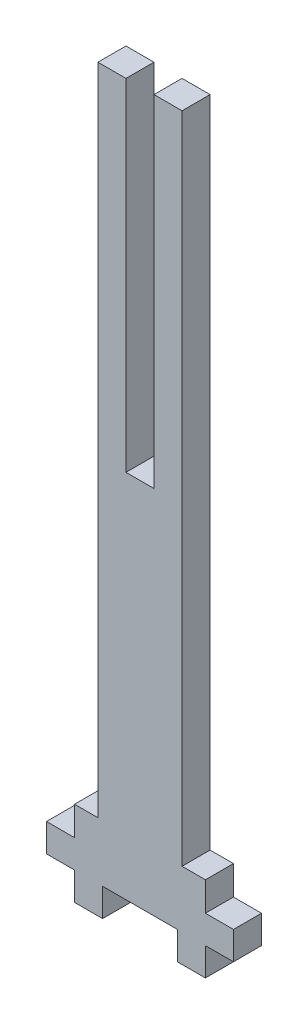
ISO-10303-21;
HEADER;
FILE_DESCRIPTION(('STEP AP214'),'2;1');
FILE_NAME('part.step','',(''),(''),'','','');
FILE_SCHEMA(('AUTOMOTIVE_DESIGN { 1 0 10303 214 1 1 1 1 }'));
ENDSEC;
DATA;
#1=APPLICATION_CONTEXT('core data for automotive mechanical design processes');
#2=APPLICATION_PROTOCOL_DEFINITION('international standard','automotive_design',2000,#1);
#3=PRODUCT_CONTEXT('',#1,'mechanical');
#4=PRODUCT('Part','Part','',(#3));
#5=PRODUCT_RELATED_PRODUCT_CATEGORY('part','',(#4));
#6=PRODUCT_DEFINITION_FORMATION('','',#4);
#7=PRODUCT_DEFINITION_CONTEXT('part definition',#1,'design');
#8=PRODUCT_DEFINITION('design','',#6,#7);
#9=PRODUCT_DEFINITION_SHAPE('','',#8);
#10=(LENGTH_UNIT() NAMED_UNIT(*) SI_UNIT(.MILLI.,.METRE.));
#11=(NAMED_UNIT(*) PLANE_ANGLE_UNIT() SI_UNIT($,.RADIAN.));
#12=(NAMED_UNIT(*) SI_UNIT($,.STERADIAN.) SOLID_ANGLE_UNIT());
#13=UNCERTAINTY_MEASURE_WITH_UNIT(LENGTH_MEASURE(1.E-05),#10,'distance_accuracy_value','');
#14=(GEOMETRIC_REPRESENTATION_CONTEXT(3) GLOBAL_UNCERTAINTY_ASSIGNED_CONTEXT((#13)) GLOBAL_UNIT_ASSIGNED_CONTEXT((#10,
#11,#12)) REPRESENTATION_CONTEXT('',''));
#15=CARTESIAN_POINT('',(0.,0.,0.));
#16=DIRECTION('',(0.,0.,1.));
#17=DIRECTION('',(1.,0.,0.));
#18=AXIS2_PLACEMENT_3D('',#15,#16,#17);
#19=CARTESIAN_POINT('',(7.,0.,3.));
#20=DIRECTION('',(-1.,0.,0.));
#21=DIRECTION('',(0.,0.,1.));
#22=AXIS2_PLACEMENT_3D('',#19,#20,#21);
#23=PLANE('',#22);
#24=DIRECTION('',(0.,0.,1.));
#25=VECTOR('',#24,1.);
#26=CARTESIAN_POINT('',(7.,-33.545999937,0.));
#27=LINE('',#26,#25);
#28=CARTESIAN_POINT('',(7.,-33.545999937,0.));
#29=VERTEX_POINT('',#28);
#30=CARTESIAN_POINT('',(7.,-33.545999937,3.));
#31=VERTEX_POINT('',#30);
#32=EDGE_CURVE('E366',#29,#31,#27,.T.);
#33=ORIENTED_EDGE('',*,*,#32,.F.);
#34=DIRECTION('',(0.,1.,0.));
#35=VECTOR('',#34,1.);
#36=CARTESIAN_POINT('',(7.,0.,0.));
#37=LINE('',#36,#35);
#38=CARTESIAN_POINT('',(7.,-30.445999937,0.));
#39=VERTEX_POINT('',#38);
#40=EDGE_CURVE('E252',#29,#39,#37,.T.);
#41=ORIENTED_EDGE('',*,*,#40,.T.);
#42=DIRECTION('',(0.,0.,-1.));
#43=VECTOR('',#42,1.);
#44=CARTESIAN_POINT('',(7.,-30.445999937,3.));
#45=LINE('',#44,#43);
#46=CARTESIAN_POINT('',(7.,-30.445999937,3.));
#47=VERTEX_POINT('',#46);
#48=EDGE_CURVE('E274',#47,#39,#45,.T.);
#49=ORIENTED_EDGE('',*,*,#48,.F.);
#50=DIRECTION('',(0.,1.,0.));
#51=VECTOR('',#50,1.);
#52=CARTESIAN_POINT('',(7.,0.,3.));
#53=LINE('',#52,#51);
#54=EDGE_CURVE('E402',#31,#47,#53,.T.);
#55=ORIENTED_EDGE('',*,*,#54,.F.);
#56=EDGE_LOOP('',(#33,#41,#49,#55));
#57=FACE_BOUND('',#56,.T.);
#58=ADVANCED_FACE('F50',(#57),#23,.F.);
#59=CARTESIAN_POINT('',(-7.,0.,3.));
#60=DIRECTION('',(1.,0.,0.));
#61=DIRECTION('',(0.,0.,-1.));
#62=AXIS2_PLACEMENT_3D('',#59,#60,#61);
#63=PLANE('',#62);
#64=DIRECTION('',(0.,0.,1.));
#65=VECTOR('',#64,1.);
#66=CARTESIAN_POINT('',(-7.,-36.545999937,0.));
#67=LINE('',#66,#65);
#68=CARTESIAN_POINT('',(-7.,-36.545999937,0.));
#69=VERTEX_POINT('',#68);
#70=CARTESIAN_POINT('',(-7.,-36.545999937,3.));
#71=VERTEX_POINT('',#70);
#72=EDGE_CURVE('E334',#69,#71,#67,.T.);
#73=ORIENTED_EDGE('',*,*,#72,.F.);
#74=DIRECTION('',(0.,-1.,0.));
#75=VECTOR('',#74,1.);
#76=CARTESIAN_POINT('',(-7.,0.,0.));
#77=LINE('',#76,#75);
#78=CARTESIAN_POINT('',(-7.,-39.545999937,0.));
#79=VERTEX_POINT('',#78);
#80=EDGE_CURVE('E313',#69,#79,#77,.T.);
#81=ORIENTED_EDGE('',*,*,#80,.T.);
#82=DIRECTION('',(0.,0.,-1.));
#83=VECTOR('',#82,1.);
#84=CARTESIAN_POINT('',(-7.,-39.545999937,3.));
#85=LINE('',#84,#83);
#86=CARTESIAN_POINT('',(-7.,-39.545999937,3.));
#87=VERTEX_POINT('',#86);
#88=EDGE_CURVE('E287',#87,#79,#85,.T.);
#89=ORIENTED_EDGE('',*,*,#88,.F.);
#90=DIRECTION('',(0.,-1.,0.));
#91=VECTOR('',#90,1.);
#92=CARTESIAN_POINT('',(-7.,0.,3.));
#93=LINE('',#92,#91);
#94=EDGE_CURVE('E348',#71,#87,#93,.T.);
#95=ORIENTED_EDGE('',*,*,#94,.F.);
#96=EDGE_LOOP('',(#73,#81,#89,#95));
#97=FACE_BOUND('',#96,.T.);
#98=ADVANCED_FACE('F331',(#97),#63,.F.);
#99=CARTESIAN_POINT('',(0.,39.545999937,3.));
#100=DIRECTION('',(0.,1.,0.));
#101=DIRECTION('',(0.,0.,1.));
#102=AXIS2_PLACEMENT_3D('',#99,#100,#101);
#103=PLANE('',#102);
#104=DIRECTION('',(0.,0.,1.));
#105=VECTOR('',#104,1.);
#106=CARTESIAN_POINT('',(1.5,39.545999937,-36.6190935360435));
#107=LINE('',#106,#105);
#108=CARTESIAN_POINT('',(1.5,39.545999937,0.));
#109=VERTEX_POINT('',#108);
#110=CARTESIAN_POINT('',(1.5,39.545999937,3.));
#111=VERTEX_POINT('',#110);
#112=EDGE_CURVE('E487',#109,#111,#107,.T.);
#113=ORIENTED_EDGE('',*,*,#112,.T.);
#114=DIRECTION('',(1.,0.,0.));
#115=VECTOR('',#114,1.);
#116=CARTESIAN_POINT('',(0.,39.545999937,3.));
#117=LINE('',#116,#115);
#118=CARTESIAN_POINT('',(4.5,39.545999937,3.));
#119=VERTEX_POINT('',#118);
#120=EDGE_CURVE('E265',#111,#119,#117,.T.);
#121=ORIENTED_EDGE('',*,*,#120,.T.);
#122=DIRECTION('',(0.,0.,-1.));
#123=VECTOR('',#122,1.);
#124=CARTESIAN_POINT('',(4.5,39.545999937,3.));
#125=LINE('',#124,#123);
#126=CARTESIAN_POINT('',(4.5,39.545999937,0.));
#127=VERTEX_POINT('',#126);
#128=EDGE_CURVE('E266',#119,#127,#125,.T.);
#129=ORIENTED_EDGE('',*,*,#128,.T.);
#130=DIRECTION('',(1.,0.,0.));
#131=VECTOR('',#130,1.);
#132=CARTESIAN_POINT('',(0.,39.545999937,0.));
#133=LINE('',#132,#131);
#134=EDGE_CURVE('E321',#109,#127,#133,.T.);
#135=ORIENTED_EDGE('',*,*,#134,.F.);
#136=EDGE_LOOP('',(#113,#121,#129,#135));
#137=FACE_BOUND('',#136,.T.);
#138=ADVANCED_FACE('F531',(#137),#103,.T.);
#139=DIRECTION('',(0.,0.,1.));
#140=VECTOR('',#139,1.);
#141=CARTESIAN_POINT('',(-1.5,39.545999937,-36.6190935360435));
#142=LINE('',#141,#140);
#143=CARTESIAN_POINT('',(-1.5,39.545999937,0.));
#144=VERTEX_POINT('',#143);
#145=CARTESIAN_POINT('',(-1.5,39.545999937,3.));
#146=VERTEX_POINT('',#145);
#147=EDGE_CURVE('E493',#144,#146,#142,.T.);
#148=ORIENTED_EDGE('',*,*,#147,.F.);
#149=CARTESIAN_POINT('',(-4.5,39.545999937,0.));
#150=VERTEX_POINT('',#149);
#151=EDGE_CURVE('E318',#150,#144,#133,.T.);
#152=ORIENTED_EDGE('',*,*,#151,.F.);
#153=DIRECTION('',(0.,0.,-1.));
#154=VECTOR('',#153,1.);
#155=CARTESIAN_POINT('',(-4.5,39.545999937,3.));
#156=LINE('',#155,#154);
#157=CARTESIAN_POINT('',(-4.5,39.545999937,3.));
#158=VERTEX_POINT('',#157);
#159=EDGE_CURVE('E12',#158,#150,#156,.T.);
#160=ORIENTED_EDGE('',*,*,#159,.F.);
#161=EDGE_CURVE('E498',#158,#146,#117,.T.);
#162=ORIENTED_EDGE('',*,*,#161,.T.);
#163=EDGE_LOOP('',(#148,#152,#160,#162));
#164=FACE_BOUND('',#163,.T.);
#165=ADVANCED_FACE('F52',(#164),#103,.T.);
#166=CARTESIAN_POINT('',(-4.5,0.,3.));
#167=DIRECTION('',(-1.,0.,0.));
#168=DIRECTION('',(0.,0.,1.));
#169=AXIS2_PLACEMENT_3D('',#166,#167,#168);
#170=PLANE('',#169);
#171=DIRECTION('',(0.,1.,0.));
#172=VECTOR('',#171,1.);
#173=CARTESIAN_POINT('',(-4.5,0.,0.));
#174=LINE('',#173,#172);
#175=CARTESIAN_POINT('',(-4.5,-30.445999937,0.));
#176=VERTEX_POINT('',#175);
#177=EDGE_CURVE('E309',#176,#150,#174,.T.);
#178=ORIENTED_EDGE('',*,*,#177,.F.);
#179=DIRECTION('',(0.,0.,-1.));
#180=VECTOR('',#179,1.);
#181=CARTESIAN_POINT('',(-4.5,-30.445999937,3.));
#182=LINE('',#181,#180);
#183=CARTESIAN_POINT('',(-4.5,-30.445999937,3.));
#184=VERTEX_POINT('',#183);
#185=EDGE_CURVE('E59',#184,#176,#182,.T.);
#186=ORIENTED_EDGE('',*,*,#185,.F.);
#187=DIRECTION('',(0.,1.,0.));
#188=VECTOR('',#187,1.);
#189=CARTESIAN_POINT('',(-4.5,0.,3.));
#190=LINE('',#189,#188);
#191=EDGE_CURVE('E503',#184,#158,#190,.T.);
#192=ORIENTED_EDGE('',*,*,#191,.T.);
#193=ORIENTED_EDGE('',*,*,#159,.T.);
#194=EDGE_LOOP('',(#178,#186,#192,#193));
#195=FACE_BOUND('',#194,.T.);
#196=ADVANCED_FACE('F315',(#195),#170,.T.);
#197=CARTESIAN_POINT('',(0.,-30.445999937,3.));
#198=DIRECTION('',(0.,-1.,0.));
#199=DIRECTION('',(1.,0.,0.));
#200=AXIS2_PLACEMENT_3D('',#197,#198,#199);
#201=PLANE('',#200);
#202=DIRECTION('',(-1.,0.,0.));
#203=VECTOR('',#202,1.);
#204=CARTESIAN_POINT('',(0.,-30.445999937,0.));
#205=LINE('',#204,#203);
#206=CARTESIAN_POINT('',(-7.,-30.445999937,0.));
#207=VERTEX_POINT('',#206);
#208=EDGE_CURVE('E300',#176,#207,#205,.T.);
#209=ORIENTED_EDGE('',*,*,#208,.T.);
#210=DIRECTION('',(0.,0.,-1.));
#211=VECTOR('',#210,1.);
#212=CARTESIAN_POINT('',(-7.,-30.445999937,3.));
#213=LINE('',#212,#211);
#214=CARTESIAN_POINT('',(-7.,-30.445999937,3.));
#215=VERTEX_POINT('',#214);
#216=EDGE_CURVE('E291',#215,#207,#213,.T.);
#217=ORIENTED_EDGE('',*,*,#216,.F.);
#218=DIRECTION('',(-1.,0.,0.));
#219=VECTOR('',#218,1.);
#220=CARTESIAN_POINT('',(0.,-30.445999937,3.));
#221=LINE('',#220,#219);
#222=EDGE_CURVE('E301',#184,#215,#221,.T.);
#223=ORIENTED_EDGE('',*,*,#222,.F.);
#224=ORIENTED_EDGE('',*,*,#185,.T.);
#225=EDGE_LOOP('',(#209,#217,#223,#224));
#226=FACE_BOUND('',#225,.T.);
#227=ADVANCED_FACE('F298',(#226),#201,.F.);
#228=CARTESIAN_POINT('',(-7.,-33.545999937,0.));
#229=VERTEX_POINT('',#228);
#230=EDGE_CURVE('E246',#207,#229,#77,.T.);
#231=ORIENTED_EDGE('',*,*,#230,.T.);
#232=DIRECTION('',(0.,0.,1.));
#233=VECTOR('',#232,1.);
#234=CARTESIAN_POINT('',(-7.,-33.545999937,0.));
#235=LINE('',#234,#233);
#236=CARTESIAN_POINT('',(-7.,-33.545999937,3.));
#237=VERTEX_POINT('',#236);
#238=EDGE_CURVE('E432',#229,#237,#235,.T.);
#239=ORIENTED_EDGE('',*,*,#238,.T.);
#240=EDGE_CURVE('E342',#215,#237,#93,.T.);
#241=ORIENTED_EDGE('',*,*,#240,.F.);
#242=ORIENTED_EDGE('',*,*,#216,.T.);
#243=EDGE_LOOP('',(#231,#239,#241,#242));
#244=FACE_BOUND('',#243,.T.);
#245=ADVANCED_FACE('F598',(#244),#63,.F.);
#246=CARTESIAN_POINT('',(0.,-39.545999937,3.));
#247=DIRECTION('',(0.,1.,0.));
#248=DIRECTION('',(0.,0.,1.));
#249=AXIS2_PLACEMENT_3D('',#246,#247,#248);
#250=PLANE('',#249);
#251=DIRECTION('',(1.,0.,0.));
#252=VECTOR('',#251,1.);
#253=CARTESIAN_POINT('',(0.,-39.545999937,0.));
#254=LINE('',#253,#252);
#255=CARTESIAN_POINT('',(-4.,-39.545999937,0.));
#256=VERTEX_POINT('',#255);
#257=EDGE_CURVE('E240',#79,#256,#254,.T.);
#258=ORIENTED_EDGE('',*,*,#257,.T.);
#259=DIRECTION('',(0.,0.,-1.));
#260=VECTOR('',#259,1.);
#261=CARTESIAN_POINT('',(-4.,-39.545999937,3.));
#262=LINE('',#261,#260);
#263=CARTESIAN_POINT('',(-4.,-39.545999937,3.));
#264=VERTEX_POINT('',#263);
#265=EDGE_CURVE('E238',#264,#256,#262,.T.);
#266=ORIENTED_EDGE('',*,*,#265,.F.);
#267=DIRECTION('',(1.,0.,0.));
#268=VECTOR('',#267,1.);
#269=CARTESIAN_POINT('',(0.,-39.545999937,3.));
#270=LINE('',#269,#268);
#271=EDGE_CURVE('E338',#87,#264,#270,.T.);
#272=ORIENTED_EDGE('',*,*,#271,.F.);
#273=ORIENTED_EDGE('',*,*,#88,.T.);
#274=EDGE_LOOP('',(#258,#266,#272,#273));
#275=FACE_BOUND('',#274,.T.);
#276=ADVANCED_FACE('F337',(#275),#250,.F.);
#277=CARTESIAN_POINT('',(-4.,0.,3.));
#278=DIRECTION('',(-1.,0.,0.));
#279=DIRECTION('',(0.,0.,1.));
#280=AXIS2_PLACEMENT_3D('',#277,#278,#279);
#281=PLANE('',#280);
#282=DIRECTION('',(0.,1.,0.));
#283=VECTOR('',#282,1.);
#284=CARTESIAN_POINT('',(-4.,0.,0.));
#285=LINE('',#284,#283);
#286=CARTESIAN_POINT('',(-4.,-36.545999937,0.));
#287=VERTEX_POINT('',#286);
#288=EDGE_CURVE('E229',#256,#287,#285,.T.);
#289=ORIENTED_EDGE('',*,*,#288,.T.);
#290=DIRECTION('',(0.,0.,1.));
#291=VECTOR('',#290,1.);
#292=CARTESIAN_POINT('',(-4.,-36.545999937,0.));
#293=LINE('',#292,#291);
#294=CARTESIAN_POINT('',(-4.,-36.545999937,3.));
#295=VERTEX_POINT('',#294);
#296=EDGE_CURVE('E210',#287,#295,#293,.T.);
#297=ORIENTED_EDGE('',*,*,#296,.T.);
#298=DIRECTION('',(0.,1.,0.));
#299=VECTOR('',#298,1.);
#300=CARTESIAN_POINT('',(-4.,0.,3.));
#301=LINE('',#300,#299);
#302=EDGE_CURVE('E341',#264,#295,#301,.T.);
#303=ORIENTED_EDGE('',*,*,#302,.F.);
#304=ORIENTED_EDGE('',*,*,#265,.T.);
#305=EDGE_LOOP('',(#289,#297,#303,#304));
#306=FACE_BOUND('',#305,.T.);
#307=ADVANCED_FACE('F236',(#306),#281,.F.);
#308=CARTESIAN_POINT('',(4.,0.,3.));
#309=DIRECTION('',(-1.,0.,0.));
#310=DIRECTION('',(0.,0.,1.));
#311=AXIS2_PLACEMENT_3D('',#308,#309,#310);
#312=PLANE('',#311);
#313=DIRECTION('',(0.,0.,1.));
#314=VECTOR('',#313,1.);
#315=CARTESIAN_POINT('',(4.,-36.545999937,0.));
#316=LINE('',#315,#314);
#317=CARTESIAN_POINT('',(4.,-36.545999937,0.));
#318=VERTEX_POINT('',#317);
#319=CARTESIAN_POINT('',(4.,-36.545999937,3.));
#320=VERTEX_POINT('',#319);
#321=EDGE_CURVE('E222',#318,#320,#316,.T.);
#322=ORIENTED_EDGE('',*,*,#321,.F.);
#323=DIRECTION('',(0.,1.,0.));
#324=VECTOR('',#323,1.);
#325=CARTESIAN_POINT('',(4.,0.,0.));
#326=LINE('',#325,#324);
#327=CARTESIAN_POINT('',(4.,-39.545999937,0.));
#328=VERTEX_POINT('',#327);
#329=EDGE_CURVE('E232',#328,#318,#326,.T.);
#330=ORIENTED_EDGE('',*,*,#329,.F.);
#331=DIRECTION('',(0.,0.,-1.));
#332=VECTOR('',#331,1.);
#333=CARTESIAN_POINT('',(4.,-39.545999937,3.));
#334=LINE('',#333,#332);
#335=CARTESIAN_POINT('',(4.,-39.545999937,3.));
#336=VERTEX_POINT('',#335);
#337=EDGE_CURVE('E282',#336,#328,#334,.T.);
#338=ORIENTED_EDGE('',*,*,#337,.F.);
#339=DIRECTION('',(0.,1.,0.));
#340=VECTOR('',#339,1.);
#341=CARTESIAN_POINT('',(4.,0.,3.));
#342=LINE('',#341,#340);
#343=EDGE_CURVE('E345',#336,#320,#342,.T.);
#344=ORIENTED_EDGE('',*,*,#343,.T.);
#345=EDGE_LOOP('',(#322,#330,#338,#344));
#346=FACE_BOUND('',#345,.T.);
#347=ADVANCED_FACE('F571',(#346),#312,.T.);
#348=CARTESIAN_POINT('',(0.,-39.545999937,3.));
#349=DIRECTION('',(0.,1.,0.));
#350=DIRECTION('',(0.,0.,1.));
#351=AXIS2_PLACEMENT_3D('',#348,#349,#350);
#352=PLANE('',#351);
#353=DIRECTION('',(1.,0.,0.));
#354=VECTOR('',#353,1.);
#355=CARTESIAN_POINT('',(0.,-39.545999937,0.));
#356=LINE('',#355,#354);
#357=CARTESIAN_POINT('',(7.,-39.545999937,0.));
#358=VERTEX_POINT('',#357);
#359=EDGE_CURVE('E244',#328,#358,#356,.T.);
#360=ORIENTED_EDGE('',*,*,#359,.T.);
#361=DIRECTION('',(0.,0.,-1.));
#362=VECTOR('',#361,1.);
#363=CARTESIAN_POINT('',(7.,-39.545999937,3.));
#364=LINE('',#363,#362);
#365=CARTESIAN_POINT('',(7.,-39.545999937,3.));
#366=VERTEX_POINT('',#365);
#367=EDGE_CURVE('E278',#366,#358,#364,.T.);
#368=ORIENTED_EDGE('',*,*,#367,.F.);
#369=DIRECTION('',(1.,0.,0.));
#370=VECTOR('',#369,1.);
#371=CARTESIAN_POINT('',(0.,-39.545999937,3.));
#372=LINE('',#371,#370);
#373=EDGE_CURVE('E403',#336,#366,#372,.T.);
#374=ORIENTED_EDGE('',*,*,#373,.F.);
#375=ORIENTED_EDGE('',*,*,#337,.T.);
#376=EDGE_LOOP('',(#360,#368,#374,#375));
#377=FACE_BOUND('',#376,.T.);
#378=ADVANCED_FACE('F576',(#377),#352,.F.);
#379=CARTESIAN_POINT('',(7.,-36.545999937,0.));
#380=VERTEX_POINT('',#379);
#381=EDGE_CURVE('E253',#358,#380,#37,.T.);
#382=ORIENTED_EDGE('',*,*,#381,.T.);
#383=DIRECTION('',(0.,0.,1.));
#384=VECTOR('',#383,1.);
#385=CARTESIAN_POINT('',(7.,-36.545999937,0.));
#386=LINE('',#385,#384);
#387=CARTESIAN_POINT('',(7.,-36.545999937,3.));
#388=VERTEX_POINT('',#387);
#389=EDGE_CURVE('E368',#380,#388,#386,.T.);
#390=ORIENTED_EDGE('',*,*,#389,.T.);
#391=EDGE_CURVE('E397',#366,#388,#53,.T.);
#392=ORIENTED_EDGE('',*,*,#391,.F.);
#393=ORIENTED_EDGE('',*,*,#367,.T.);
#394=EDGE_LOOP('',(#382,#390,#392,#393));
#395=FACE_BOUND('',#394,.T.);
#396=ADVANCED_FACE('F579',(#395),#23,.F.);
#397=CARTESIAN_POINT('',(0.,-30.445999937,3.));
#398=DIRECTION('',(0.,-1.,0.));
#399=DIRECTION('',(0.,0.,-1.));
#400=AXIS2_PLACEMENT_3D('',#397,#398,#399);
#401=PLANE('',#400);
#402=DIRECTION('',(-1.,0.,0.));
#403=VECTOR('',#402,1.);
#404=CARTESIAN_POINT('',(0.,-30.445999937,0.));
#405=LINE('',#404,#403);
#406=CARTESIAN_POINT('',(4.5,-30.445999937,0.));
#407=VERTEX_POINT('',#406);
#408=EDGE_CURVE('E257',#39,#407,#405,.T.);
#409=ORIENTED_EDGE('',*,*,#408,.T.);
#410=DIRECTION('',(0.,0.,-1.));
#411=VECTOR('',#410,1.);
#412=CARTESIAN_POINT('',(4.5,-30.445999937,3.));
#413=LINE('',#412,#411);
#414=CARTESIAN_POINT('',(4.5,-30.445999937,3.));
#415=VERTEX_POINT('',#414);
#416=EDGE_CURVE('E270',#415,#407,#413,.T.);
#417=ORIENTED_EDGE('',*,*,#416,.F.);
#418=DIRECTION('',(-1.,0.,0.));
#419=VECTOR('',#418,1.);
#420=CARTESIAN_POINT('',(0.,-30.445999937,3.));
#421=LINE('',#420,#419);
#422=EDGE_CURVE('E401',#47,#415,#421,.T.);
#423=ORIENTED_EDGE('',*,*,#422,.F.);
#424=ORIENTED_EDGE('',*,*,#48,.T.);
#425=EDGE_LOOP('',(#409,#417,#423,#424));
#426=FACE_BOUND('',#425,.T.);
#427=ADVANCED_FACE('F602',(#426),#401,.F.);
#428=CARTESIAN_POINT('',(4.5,0.,3.));
#429=DIRECTION('',(1.,0.,0.));
#430=DIRECTION('',(0.,0.,-1.));
#431=AXIS2_PLACEMENT_3D('',#428,#429,#430);
#432=PLANE('',#431);
#433=DIRECTION('',(0.,-1.,0.));
#434=VECTOR('',#433,1.);
#435=CARTESIAN_POINT('',(4.5,0.,0.));
#436=LINE('',#435,#434);
#437=EDGE_CURVE('E261',#127,#407,#436,.T.);
#438=ORIENTED_EDGE('',*,*,#437,.F.);
#439=ORIENTED_EDGE('',*,*,#128,.F.);
#440=DIRECTION('',(0.,-1.,0.));
#441=VECTOR('',#440,1.);
#442=CARTESIAN_POINT('',(4.5,0.,3.));
#443=LINE('',#442,#441);
#444=EDGE_CURVE('E271',#119,#415,#443,.T.);
#445=ORIENTED_EDGE('',*,*,#444,.T.);
#446=ORIENTED_EDGE('',*,*,#416,.T.);
#447=EDGE_LOOP('',(#438,#439,#445,#446));
#448=FACE_BOUND('',#447,.T.);
#449=ADVANCED_FACE('F559',(#448),#432,.T.);
#450=CARTESIAN_POINT('',(0.,0.,3.));
#451=DIRECTION('',(0.,0.,1.));
#452=DIRECTION('',(1.,0.,0.));
#453=AXIS2_PLACEMENT_3D('',#450,#451,#452);
#454=PLANE('',#453);
#455=ORIENTED_EDGE('',*,*,#302,.T.);
#456=DIRECTION('',(1.,0.,0.));
#457=VECTOR('',#456,1.);
#458=CARTESIAN_POINT('',(-4.,-36.545999937,3.));
#459=LINE('',#458,#457);
#460=EDGE_CURVE('E216',#295,#320,#459,.T.);
#461=ORIENTED_EDGE('',*,*,#460,.T.);
#462=ORIENTED_EDGE('',*,*,#343,.F.);
#463=ORIENTED_EDGE('',*,*,#373,.T.);
#464=ORIENTED_EDGE('',*,*,#391,.T.);
#465=DIRECTION('',(1.,0.,0.));
#466=VECTOR('',#465,1.);
#467=CARTESIAN_POINT('',(7.,-36.545999937,3.));
#468=LINE('',#467,#466);
#469=CARTESIAN_POINT('',(10.,-36.545999937,3.));
#470=VERTEX_POINT('',#469);
#471=EDGE_CURVE('E66',#388,#470,#468,.T.);
#472=ORIENTED_EDGE('',*,*,#471,.T.);
#473=DIRECTION('',(0.,1.,0.));
#474=VECTOR('',#473,1.);
#475=CARTESIAN_POINT('',(10.,-36.545999937,3.));
#476=LINE('',#475,#474);
#477=CARTESIAN_POINT('',(10.,-33.545999937,3.));
#478=VERTEX_POINT('',#477);
#479=EDGE_CURVE('E385',#470,#478,#476,.T.);
#480=ORIENTED_EDGE('',*,*,#479,.T.);
#481=DIRECTION('',(-1.,0.,0.));
#482=VECTOR('',#481,1.);
#483=CARTESIAN_POINT('',(7.,-33.545999937,3.));
#484=LINE('',#483,#482);
#485=EDGE_CURVE('E380',#478,#31,#484,.T.);
#486=ORIENTED_EDGE('',*,*,#485,.T.);
#487=ORIENTED_EDGE('',*,*,#54,.T.);
#488=ORIENTED_EDGE('',*,*,#422,.T.);
#489=ORIENTED_EDGE('',*,*,#444,.F.);
#490=ORIENTED_EDGE('',*,*,#120,.F.);
#491=DIRECTION('',(0.,1.,0.));
#492=VECTOR('',#491,1.);
#493=CARTESIAN_POINT('',(1.5,39.545999937,3.));
#494=LINE('',#493,#492);
#495=CARTESIAN_POINT('',(1.5,3.05,3.));
#496=VERTEX_POINT('',#495);
#497=EDGE_CURVE('E450',#496,#111,#494,.T.);
#498=ORIENTED_EDGE('',*,*,#497,.F.);
#499=DIRECTION('',(1.,0.,0.));
#500=VECTOR('',#499,1.);
#501=CARTESIAN_POINT('',(-1.5,3.05,3.));
#502=LINE('',#501,#500);
#503=CARTESIAN_POINT('',(-1.5,3.05,3.));
#504=VERTEX_POINT('',#503);
#505=EDGE_CURVE('E482',#504,#496,#502,.T.);
#506=ORIENTED_EDGE('',*,*,#505,.F.);
#507=DIRECTION('',(0.,-1.,0.));
#508=VECTOR('',#507,1.);
#509=CARTESIAN_POINT('',(-1.5,39.545999937,3.));
#510=LINE('',#509,#508);
#511=EDGE_CURVE('E473',#146,#504,#510,.T.);
#512=ORIENTED_EDGE('',*,*,#511,.F.);
#513=ORIENTED_EDGE('',*,*,#161,.F.);
#514=ORIENTED_EDGE('',*,*,#191,.F.);
#515=ORIENTED_EDGE('',*,*,#222,.T.);
#516=ORIENTED_EDGE('',*,*,#240,.T.);
#517=DIRECTION('',(-1.,0.,0.));
#518=VECTOR('',#517,1.);
#519=CARTESIAN_POINT('',(-7.,-33.545999937,3.));
#520=LINE('',#519,#518);
#521=CARTESIAN_POINT('',(-10.,-33.545999937,3.));
#522=VERTEX_POINT('',#521);
#523=EDGE_CURVE('E74',#237,#522,#520,.T.);
#524=ORIENTED_EDGE('',*,*,#523,.T.);
#525=DIRECTION('',(0.,-1.,0.));
#526=VECTOR('',#525,1.);
#527=CARTESIAN_POINT('',(-10.,-36.545999937,3.));
#528=LINE('',#527,#526);
#529=CARTESIAN_POINT('',(-10.,-36.545999937,3.));
#530=VERTEX_POINT('',#529);
#531=EDGE_CURVE('E436',#522,#530,#528,.T.);
#532=ORIENTED_EDGE('',*,*,#531,.T.);
#533=DIRECTION('',(1.,0.,0.));
#534=VECTOR('',#533,1.);
#535=CARTESIAN_POINT('',(-7.,-36.545999937,3.));
#536=LINE('',#535,#534);
#537=EDGE_CURVE('E425',#530,#71,#536,.T.);
#538=ORIENTED_EDGE('',*,*,#537,.T.);
#539=ORIENTED_EDGE('',*,*,#94,.T.);
#540=ORIENTED_EDGE('',*,*,#271,.T.);
#541=EDGE_LOOP('',(#455,#461,#462,#463,#464,#472,#480,#486,#487,#488,#489,#490,#498,#506,#512,
#513,#514,#515,#516,#524,#532,#538,#539,#540));
#542=FACE_BOUND('',#541,.T.);
#543=ADVANCED_FACE('F512',(#542),#454,.T.);
#544=CARTESIAN_POINT('',(0.,0.,0.));
#545=DIRECTION('',(0.,0.,1.));
#546=DIRECTION('',(1.,0.,0.));
#547=AXIS2_PLACEMENT_3D('',#544,#545,#546);
#548=PLANE('',#547);
#549=DIRECTION('',(1.,0.,0.));
#550=VECTOR('',#549,1.);
#551=CARTESIAN_POINT('',(-4.,-36.545999937,0.));
#552=LINE('',#551,#550);
#553=EDGE_CURVE('E213',#287,#318,#552,.T.);
#554=ORIENTED_EDGE('',*,*,#553,.F.);
#555=ORIENTED_EDGE('',*,*,#288,.F.);
#556=ORIENTED_EDGE('',*,*,#257,.F.);
#557=ORIENTED_EDGE('',*,*,#80,.F.);
#558=DIRECTION('',(1.,0.,0.));
#559=VECTOR('',#558,1.);
#560=CARTESIAN_POINT('',(-7.,-36.545999937,0.));
#561=LINE('',#560,#559);
#562=CARTESIAN_POINT('',(-10.,-36.545999937,0.));
#563=VERTEX_POINT('',#562);
#564=EDGE_CURVE('E429',#563,#69,#561,.T.);
#565=ORIENTED_EDGE('',*,*,#564,.F.);
#566=DIRECTION('',(0.,-1.,0.));
#567=VECTOR('',#566,1.);
#568=CARTESIAN_POINT('',(-10.,-36.545999937,0.));
#569=LINE('',#568,#567);
#570=CARTESIAN_POINT('',(-10.,-33.545999937,0.));
#571=VERTEX_POINT('',#570);
#572=EDGE_CURVE('E424',#571,#563,#569,.T.);
#573=ORIENTED_EDGE('',*,*,#572,.F.);
#574=DIRECTION('',(-1.,0.,0.));
#575=VECTOR('',#574,1.);
#576=CARTESIAN_POINT('',(-7.,-33.545999937,0.));
#577=LINE('',#576,#575);
#578=EDGE_CURVE('E420',#229,#571,#577,.T.);
#579=ORIENTED_EDGE('',*,*,#578,.F.);
#580=ORIENTED_EDGE('',*,*,#230,.F.);
#581=ORIENTED_EDGE('',*,*,#208,.F.);
#582=ORIENTED_EDGE('',*,*,#177,.T.);
#583=ORIENTED_EDGE('',*,*,#151,.T.);
#584=DIRECTION('',(0.,1.,0.));
#585=VECTOR('',#584,1.);
#586=CARTESIAN_POINT('',(-1.5,39.545999937,0.));
#587=LINE('',#586,#585);
#588=CARTESIAN_POINT('',(-1.5,3.05,0.));
#589=VERTEX_POINT('',#588);
#590=EDGE_CURVE('E459',#589,#144,#587,.T.);
#591=ORIENTED_EDGE('',*,*,#590,.F.);
#592=DIRECTION('',(-1.,0.,0.));
#593=VECTOR('',#592,1.);
#594=CARTESIAN_POINT('',(-1.5,3.05,0.));
#595=LINE('',#594,#593);
#596=CARTESIAN_POINT('',(1.5,3.05,0.));
#597=VERTEX_POINT('',#596);
#598=EDGE_CURVE('E462',#597,#589,#595,.T.);
#599=ORIENTED_EDGE('',*,*,#598,.F.);
#600=DIRECTION('',(0.,-1.,0.));
#601=VECTOR('',#600,1.);
#602=CARTESIAN_POINT('',(1.5,39.545999937,0.));
#603=LINE('',#602,#601);
#604=EDGE_CURVE('E467',#109,#597,#603,.T.);
#605=ORIENTED_EDGE('',*,*,#604,.F.);
#606=ORIENTED_EDGE('',*,*,#134,.T.);
#607=ORIENTED_EDGE('',*,*,#437,.T.);
#608=ORIENTED_EDGE('',*,*,#408,.F.);
#609=ORIENTED_EDGE('',*,*,#40,.F.);
#610=DIRECTION('',(-1.,0.,0.));
#611=VECTOR('',#610,1.);
#612=CARTESIAN_POINT('',(7.,-33.545999937,0.));
#613=LINE('',#612,#611);
#614=CARTESIAN_POINT('',(10.,-33.545999937,0.));
#615=VERTEX_POINT('',#614);
#616=EDGE_CURVE('E371',#615,#29,#613,.T.);
#617=ORIENTED_EDGE('',*,*,#616,.F.);
#618=DIRECTION('',(0.,1.,0.));
#619=VECTOR('',#618,1.);
#620=CARTESIAN_POINT('',(10.,-36.545999937,0.));
#621=LINE('',#620,#619);
#622=CARTESIAN_POINT('',(10.,-36.545999937,0.));
#623=VERTEX_POINT('',#622);
#624=EDGE_CURVE('E413',#623,#615,#621,.T.);
#625=ORIENTED_EDGE('',*,*,#624,.F.);
#626=DIRECTION('',(1.,0.,0.));
#627=VECTOR('',#626,1.);
#628=CARTESIAN_POINT('',(7.,-36.545999937,0.));
#629=LINE('',#628,#627);
#630=EDGE_CURVE('E386',#380,#623,#629,.T.);
#631=ORIENTED_EDGE('',*,*,#630,.F.);
#632=ORIENTED_EDGE('',*,*,#381,.F.);
#633=ORIENTED_EDGE('',*,*,#359,.F.);
#634=ORIENTED_EDGE('',*,*,#329,.T.);
#635=EDGE_LOOP('',(#554,#555,#556,#557,#565,#573,#579,#580,#581,#582,#583,#591,#599,#605,#606,
#607,#608,#609,#617,#625,#631,#632,#633,#634));
#636=FACE_BOUND('',#635,.T.);
#637=ADVANCED_FACE('F227',(#636),#548,.F.);
#638=CARTESIAN_POINT('',(1.5,39.545999937,-36.6190935360435));
#639=DIRECTION('',(1.,0.,0.));
#640=DIRECTION('',(0.,1.,0.));
#641=AXIS2_PLACEMENT_3D('',#638,#639,#640);
#642=PLANE('',#641);
#643=ORIENTED_EDGE('',*,*,#604,.T.);
#644=DIRECTION('',(0.,0.,1.));
#645=VECTOR('',#644,1.);
#646=CARTESIAN_POINT('',(1.5,3.05,-36.6190935360435));
#647=LINE('',#646,#645);
#648=EDGE_CURVE('E463',#597,#496,#647,.T.);
#649=ORIENTED_EDGE('',*,*,#648,.T.);
#650=ORIENTED_EDGE('',*,*,#497,.T.);
#651=ORIENTED_EDGE('',*,*,#112,.F.);
#652=EDGE_LOOP('',(#643,#649,#650,#651));
#653=FACE_BOUND('',#652,.T.);
#654=ADVANCED_FACE('F528',(#653),#642,.F.);
#655=CARTESIAN_POINT('',(-1.5,3.05,-36.6190935360435));
#656=DIRECTION('',(0.,-1.,0.));
#657=DIRECTION('',(1.,0.,0.));
#658=AXIS2_PLACEMENT_3D('',#655,#656,#657);
#659=PLANE('',#658);
#660=ORIENTED_EDGE('',*,*,#598,.T.);
#661=DIRECTION('',(0.,0.,1.));
#662=VECTOR('',#661,1.);
#663=CARTESIAN_POINT('',(-1.5,3.05,-36.6190935360435));
#664=LINE('',#663,#662);
#665=EDGE_CURVE('E490',#589,#504,#664,.T.);
#666=ORIENTED_EDGE('',*,*,#665,.T.);
#667=ORIENTED_EDGE('',*,*,#505,.T.);
#668=ORIENTED_EDGE('',*,*,#648,.F.);
#669=EDGE_LOOP('',(#660,#666,#667,#668));
#670=FACE_BOUND('',#669,.T.);
#671=ADVANCED_FACE('F525',(#670),#659,.F.);
#672=CARTESIAN_POINT('',(-1.5,39.545999937,-36.6190935360435));
#673=DIRECTION('',(-1.,0.,0.));
#674=DIRECTION('',(0.,-1.,0.));
#675=AXIS2_PLACEMENT_3D('',#672,#673,#674);
#676=PLANE('',#675);
#677=ORIENTED_EDGE('',*,*,#590,.T.);
#678=ORIENTED_EDGE('',*,*,#147,.T.);
#679=ORIENTED_EDGE('',*,*,#511,.T.);
#680=ORIENTED_EDGE('',*,*,#665,.F.);
#681=EDGE_LOOP('',(#677,#678,#679,#680));
#682=FACE_BOUND('',#681,.T.);
#683=ADVANCED_FACE('F522',(#682),#676,.F.);
#684=CARTESIAN_POINT('',(-7.,-36.545999937,0.));
#685=DIRECTION('',(0.,-1.,0.));
#686=DIRECTION('',(0.,0.,-1.));
#687=AXIS2_PLACEMENT_3D('',#684,#685,#686);
#688=PLANE('',#687);
#689=ORIENTED_EDGE('',*,*,#537,.F.);
#690=DIRECTION('',(0.,0.,1.));
#691=VECTOR('',#690,1.);
#692=CARTESIAN_POINT('',(-10.,-36.545999937,0.));
#693=LINE('',#692,#691);
#694=EDGE_CURVE('E451',#563,#530,#693,.T.);
#695=ORIENTED_EDGE('',*,*,#694,.F.);
#696=ORIENTED_EDGE('',*,*,#564,.T.);
#697=ORIENTED_EDGE('',*,*,#72,.T.);
#698=EDGE_LOOP('',(#689,#695,#696,#697));
#699=FACE_BOUND('',#698,.T.);
#700=ADVANCED_FACE('F652',(#699),#688,.T.);
#701=CARTESIAN_POINT('',(-10.,-36.545999937,0.));
#702=DIRECTION('',(-1.,0.,0.));
#703=DIRECTION('',(0.,0.,1.));
#704=AXIS2_PLACEMENT_3D('',#701,#702,#703);
#705=PLANE('',#704);
#706=ORIENTED_EDGE('',*,*,#531,.F.);
#707=DIRECTION('',(0.,0.,1.));
#708=VECTOR('',#707,1.);
#709=CARTESIAN_POINT('',(-10.,-33.545999937,0.));
#710=LINE('',#709,#708);
#711=EDGE_CURVE('E454',#571,#522,#710,.T.);
#712=ORIENTED_EDGE('',*,*,#711,.F.);
#713=ORIENTED_EDGE('',*,*,#572,.T.);
#714=ORIENTED_EDGE('',*,*,#694,.T.);
#715=EDGE_LOOP('',(#706,#712,#713,#714));
#716=FACE_BOUND('',#715,.T.);
#717=ADVANCED_FACE('F850',(#716),#705,.T.);
#718=CARTESIAN_POINT('',(-7.,-33.545999937,0.));
#719=DIRECTION('',(0.,1.,0.));
#720=DIRECTION('',(0.,0.,1.));
#721=AXIS2_PLACEMENT_3D('',#718,#719,#720);
#722=PLANE('',#721);
#723=ORIENTED_EDGE('',*,*,#523,.F.);
#724=ORIENTED_EDGE('',*,*,#238,.F.);
#725=ORIENTED_EDGE('',*,*,#578,.T.);
#726=ORIENTED_EDGE('',*,*,#711,.T.);
#727=EDGE_LOOP('',(#723,#724,#725,#726));
#728=FACE_BOUND('',#727,.T.);
#729=ADVANCED_FACE('F590',(#728),#722,.T.);
#730=CARTESIAN_POINT('',(7.,-33.545999937,0.));
#731=DIRECTION('',(0.,1.,0.));
#732=DIRECTION('',(0.,0.,1.));
#733=AXIS2_PLACEMENT_3D('',#730,#731,#732);
#734=PLANE('',#733);
#735=ORIENTED_EDGE('',*,*,#485,.F.);
#736=DIRECTION('',(0.,0.,1.));
#737=VECTOR('',#736,1.);
#738=CARTESIAN_POINT('',(10.,-33.545999937,0.));
#739=LINE('',#738,#737);
#740=EDGE_CURVE('E375',#615,#478,#739,.T.);
#741=ORIENTED_EDGE('',*,*,#740,.F.);
#742=ORIENTED_EDGE('',*,*,#616,.T.);
#743=ORIENTED_EDGE('',*,*,#32,.T.);
#744=EDGE_LOOP('',(#735,#741,#742,#743));
#745=FACE_BOUND('',#744,.T.);
#746=ADVANCED_FACE('F546',(#745),#734,.T.);
#747=CARTESIAN_POINT('',(10.,-36.545999937,0.));
#748=DIRECTION('',(1.,0.,0.));
#749=DIRECTION('',(0.,0.,-1.));
#750=AXIS2_PLACEMENT_3D('',#747,#748,#749);
#751=PLANE('',#750);
#752=ORIENTED_EDGE('',*,*,#479,.F.);
#753=DIRECTION('',(0.,0.,1.));
#754=VECTOR('',#753,1.);
#755=CARTESIAN_POINT('',(10.,-36.545999937,0.));
#756=LINE('',#755,#754);
#757=EDGE_CURVE('E372',#623,#470,#756,.T.);
#758=ORIENTED_EDGE('',*,*,#757,.F.);
#759=ORIENTED_EDGE('',*,*,#624,.T.);
#760=ORIENTED_EDGE('',*,*,#740,.T.);
#761=EDGE_LOOP('',(#752,#758,#759,#760));
#762=FACE_BOUND('',#761,.T.);
#763=ADVANCED_FACE('F582',(#762),#751,.T.);
#764=CARTESIAN_POINT('',(7.,-36.545999937,0.));
#765=DIRECTION('',(0.,-1.,0.));
#766=DIRECTION('',(0.,0.,-1.));
#767=AXIS2_PLACEMENT_3D('',#764,#765,#766);
#768=PLANE('',#767);
#769=ORIENTED_EDGE('',*,*,#471,.F.);
#770=ORIENTED_EDGE('',*,*,#389,.F.);
#771=ORIENTED_EDGE('',*,*,#630,.T.);
#772=ORIENTED_EDGE('',*,*,#757,.T.);
#773=EDGE_LOOP('',(#769,#770,#771,#772));
#774=FACE_BOUND('',#773,.T.);
#775=ADVANCED_FACE('F581',(#774),#768,.T.);
#776=CARTESIAN_POINT('',(-4.,-36.545999937,0.));
#777=DIRECTION('',(0.,-1.,0.));
#778=DIRECTION('',(0.,0.,-1.));
#779=AXIS2_PLACEMENT_3D('',#776,#777,#778);
#780=PLANE('',#779);
#781=ORIENTED_EDGE('',*,*,#460,.F.);
#782=ORIENTED_EDGE('',*,*,#296,.F.);
#783=ORIENTED_EDGE('',*,*,#553,.T.);
#784=ORIENTED_EDGE('',*,*,#321,.T.);
#785=EDGE_LOOP('',(#781,#782,#783,#784));
#786=FACE_BOUND('',#785,.T.);
#787=ADVANCED_FACE('F212',(#786),#780,.T.);
#788=CLOSED_SHELL('',(#58,#98,#138,#165,#196,#227,#245,#276,#307,#347,#378,#396,#427,#449,#543,
#637,#654,#671,#683,#700,#717,#729,#746,#763,#775,#787));
#789=MANIFOLD_SOLID_BREP('B2',#788);
#790=ADVANCED_BREP_SHAPE_REPRESENTATION('',(#18,#789),#14);
#791=SHAPE_DEFINITION_REPRESENTATION(#9,#790);
ENDSEC;
END-ISO-10303-21;
